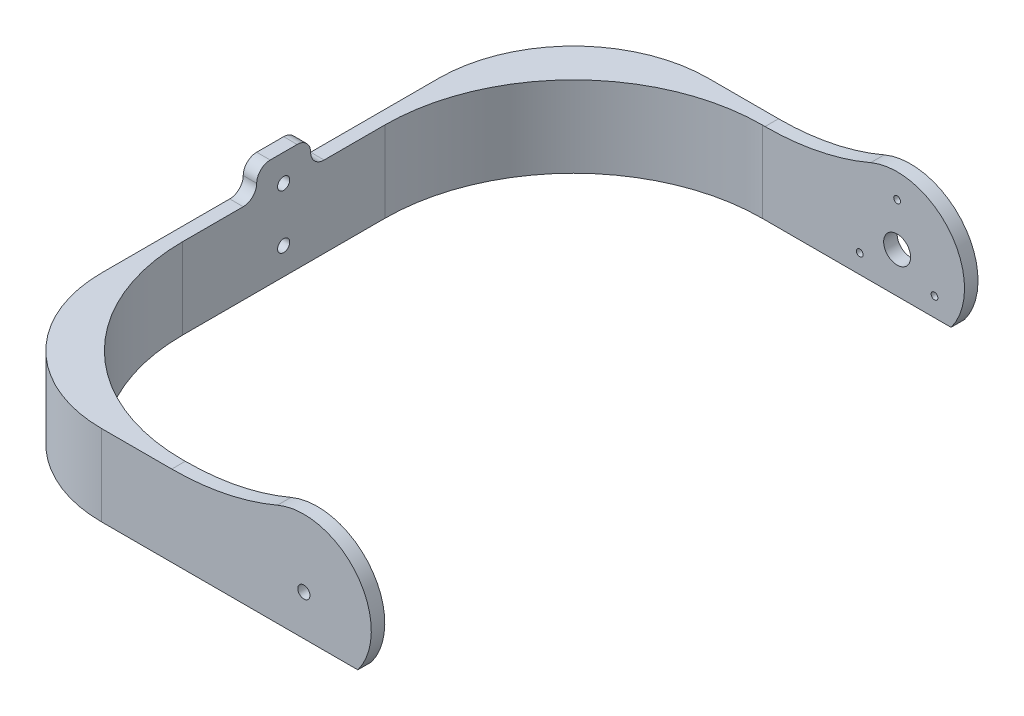
ISO-10303-21;
HEADER;
FILE_DESCRIPTION(('STEP AP214'),'2;1');
FILE_NAME('part.step','',(''),(''),'','','');
FILE_SCHEMA(('AUTOMOTIVE_DESIGN { 1 0 10303 214 1 1 1 1 }'));
ENDSEC;
DATA;
#1=APPLICATION_CONTEXT('core data for automotive mechanical design processes');
#2=APPLICATION_PROTOCOL_DEFINITION('international standard','automotive_design',2000,#1);
#3=PRODUCT_CONTEXT('',#1,'mechanical');
#4=PRODUCT('Part','Part','',(#3));
#5=PRODUCT_RELATED_PRODUCT_CATEGORY('part','',(#4));
#6=PRODUCT_DEFINITION_FORMATION('','',#4);
#7=PRODUCT_DEFINITION_CONTEXT('part definition',#1,'design');
#8=PRODUCT_DEFINITION('design','',#6,#7);
#9=PRODUCT_DEFINITION_SHAPE('','',#8);
#10=(LENGTH_UNIT() NAMED_UNIT(*) SI_UNIT(.MILLI.,.METRE.));
#11=(NAMED_UNIT(*) PLANE_ANGLE_UNIT() SI_UNIT($,.RADIAN.));
#12=(NAMED_UNIT(*) SI_UNIT($,.STERADIAN.) SOLID_ANGLE_UNIT());
#13=UNCERTAINTY_MEASURE_WITH_UNIT(LENGTH_MEASURE(1.E-05),#10,'distance_accuracy_value','');
#14=(GEOMETRIC_REPRESENTATION_CONTEXT(3) GLOBAL_UNCERTAINTY_ASSIGNED_CONTEXT((#13)) GLOBAL_UNIT_ASSIGNED_CONTEXT((#10,
#11,#12)) REPRESENTATION_CONTEXT('',''));
#15=CARTESIAN_POINT('',(0.,0.,0.));
#16=DIRECTION('',(0.,0.,1.));
#17=DIRECTION('',(1.,0.,0.));
#18=AXIS2_PLACEMENT_3D('',#15,#16,#17);
#19=CARTESIAN_POINT('',(0.,30.,112.5));
#20=DIRECTION('',(0.,-1.,0.));
#21=DIRECTION('',(0.,0.,-1.));
#22=AXIS2_PLACEMENT_3D('',#19,#20,#21);
#23=PLANE('',#22);
#24=DIRECTION('',(0.,0.,1.));
#25=VECTOR('',#24,1.);
#26=CARTESIAN_POINT('',(5.,30.,112.5));
#27=LINE('',#26,#25);
#28=CARTESIAN_POINT('',(5.,30.,15.));
#29=VERTEX_POINT('',#28);
#30=CARTESIAN_POINT('',(5.,30.,37.5));
#31=VERTEX_POINT('',#30);
#32=EDGE_CURVE('E356',#29,#31,#27,.T.);
#33=ORIENTED_EDGE('',*,*,#32,.F.);
#34=DIRECTION('',(-1.,0.,0.));
#35=VECTOR('',#34,1.);
#36=CARTESIAN_POINT('',(0.,30.,15.));
#37=LINE('',#36,#35);
#38=CARTESIAN_POINT('',(0.,30.,15.));
#39=VERTEX_POINT('',#38);
#40=EDGE_CURVE('E309',#29,#39,#37,.T.);
#41=ORIENTED_EDGE('',*,*,#40,.T.);
#42=DIRECTION('',(0.,0.,-1.));
#43=VECTOR('',#42,1.);
#44=CARTESIAN_POINT('',(0.,30.,112.5));
#45=LINE('',#44,#43);
#46=CARTESIAN_POINT('',(0.,30.,62.5));
#47=VERTEX_POINT('',#46);
#48=EDGE_CURVE('E215',#47,#39,#45,.T.);
#49=ORIENTED_EDGE('',*,*,#48,.F.);
#50=CARTESIAN_POINT('',(50.,30.,62.5));
#51=DIRECTION('',(0.,-1.,0.));
#52=DIRECTION('',(0.,0.,-1.));
#53=AXIS2_PLACEMENT_3D('',#50,#51,#52);
#54=CIRCLE('',#53,50.);
#55=CARTESIAN_POINT('',(50.,30.,112.5));
#56=VERTEX_POINT('',#55);
#57=EDGE_CURVE('E287',#47,#56,#54,.F.);
#58=ORIENTED_EDGE('',*,*,#57,.T.);
#59=DIRECTION('',(-1.,0.,0.));
#60=VECTOR('',#59,1.);
#61=CARTESIAN_POINT('',(0.,30.,112.5));
#62=LINE('',#61,#60);
#63=CARTESIAN_POINT('',(76.0102051443365,30.,112.5));
#64=VERTEX_POINT('',#63);
#65=EDGE_CURVE('E209',#64,#56,#62,.T.);
#66=ORIENTED_EDGE('',*,*,#65,.F.);
#67=DIRECTION('',(0.,0.,1.));
#68=VECTOR('',#67,1.);
#69=CARTESIAN_POINT('',(76.0102051443365,30.,107.5));
#70=LINE('',#69,#68);
#71=CARTESIAN_POINT('',(76.0102051443365,30.,107.5));
#72=VERTEX_POINT('',#71);
#73=EDGE_CURVE('E245',#64,#72,#70,.F.);
#74=ORIENTED_EDGE('',*,*,#73,.T.);
#75=DIRECTION('',(1.,0.,0.));
#76=VECTOR('',#75,1.);
#77=CARTESIAN_POINT('',(0.,30.,107.5));
#78=LINE('',#77,#76);
#79=CARTESIAN_POINT('',(75.,30.,107.5));
#80=VERTEX_POINT('',#79);
#81=EDGE_CURVE('E191',#80,#72,#78,.T.);
#82=ORIENTED_EDGE('',*,*,#81,.F.);
#83=CARTESIAN_POINT('',(75.,30.,37.5));
#84=DIRECTION('',(0.,-1.,0.));
#85=DIRECTION('',(0.,0.,-1.));
#86=AXIS2_PLACEMENT_3D('',#83,#84,#85);
#87=CIRCLE('',#86,70.);
#88=EDGE_CURVE('E273',#80,#31,#87,.T.);
#89=ORIENTED_EDGE('',*,*,#88,.T.);
#90=EDGE_LOOP('',(#33,#41,#49,#58,#66,#74,#82,#89));
#91=FACE_BOUND('',#90,.T.);
#92=ADVANCED_FACE('F32',(#91),#23,.F.);
#93=CARTESIAN_POINT('',(0.,30.,-15.));
#94=VERTEX_POINT('',#93);
#95=CARTESIAN_POINT('',(0.,30.,-62.5));
#96=VERTEX_POINT('',#95);
#97=EDGE_CURVE('E211',#94,#96,#45,.T.);
#98=ORIENTED_EDGE('',*,*,#97,.F.);
#99=DIRECTION('',(-1.,0.,0.));
#100=VECTOR('',#99,1.);
#101=CARTESIAN_POINT('',(0.,30.,-15.));
#102=LINE('',#101,#100);
#103=CARTESIAN_POINT('',(5.,30.,-15.));
#104=VERTEX_POINT('',#103);
#105=EDGE_CURVE('E307',#94,#104,#102,.F.);
#106=ORIENTED_EDGE('',*,*,#105,.T.);
#107=CARTESIAN_POINT('',(5.,30.,-37.5));
#108=VERTEX_POINT('',#107);
#109=EDGE_CURVE('E357',#108,#104,#27,.T.);
#110=ORIENTED_EDGE('',*,*,#109,.F.);
#111=CARTESIAN_POINT('',(75.,30.,-37.5));
#112=DIRECTION('',(0.,-1.,0.));
#113=DIRECTION('',(0.,0.,-1.));
#114=AXIS2_PLACEMENT_3D('',#111,#112,#113);
#115=CIRCLE('',#114,70.);
#116=CARTESIAN_POINT('',(75.,30.,-107.5));
#117=VERTEX_POINT('',#116);
#118=EDGE_CURVE('E268',#108,#117,#115,.T.);
#119=ORIENTED_EDGE('',*,*,#118,.T.);
#120=DIRECTION('',(-1.,0.,0.));
#121=VECTOR('',#120,1.);
#122=CARTESIAN_POINT('',(0.,30.,-107.5));
#123=LINE('',#122,#121);
#124=CARTESIAN_POINT('',(76.0102051443365,30.,-107.5));
#125=VERTEX_POINT('',#124);
#126=EDGE_CURVE('E192',#125,#117,#123,.T.);
#127=ORIENTED_EDGE('',*,*,#126,.F.);
#128=DIRECTION('',(0.,0.,1.));
#129=VECTOR('',#128,1.);
#130=CARTESIAN_POINT('',(76.0102051443365,30.,-112.5));
#131=LINE('',#130,#129);
#132=CARTESIAN_POINT('',(76.0102051443365,30.,-112.5));
#133=VERTEX_POINT('',#132);
#134=EDGE_CURVE('E243',#125,#133,#131,.F.);
#135=ORIENTED_EDGE('',*,*,#134,.T.);
#136=DIRECTION('',(-1.,0.,0.));
#137=VECTOR('',#136,1.);
#138=CARTESIAN_POINT('',(0.,30.,-112.5));
#139=LINE('',#138,#137);
#140=CARTESIAN_POINT('',(50.,30.,-112.5));
#141=VERTEX_POINT('',#140);
#142=EDGE_CURVE('E200',#133,#141,#139,.T.);
#143=ORIENTED_EDGE('',*,*,#142,.T.);
#144=CARTESIAN_POINT('',(50.,30.,-62.5));
#145=DIRECTION('',(0.,-1.,0.));
#146=DIRECTION('',(0.,0.,-1.));
#147=AXIS2_PLACEMENT_3D('',#144,#145,#146);
#148=CIRCLE('',#147,50.);
#149=EDGE_CURVE('E289',#141,#96,#148,.F.);
#150=ORIENTED_EDGE('',*,*,#149,.T.);
#151=EDGE_LOOP('',(#98,#106,#110,#119,#127,#135,#143,#150));
#152=FACE_BOUND('',#151,.T.);
#153=ADVANCED_FACE('F379',(#152),#23,.F.);
#154=CARTESIAN_POINT('',(0.,0.,112.5));
#155=DIRECTION('',(0.,1.,0.));
#156=DIRECTION('',(0.,0.,1.));
#157=AXIS2_PLACEMENT_3D('',#154,#155,#156);
#158=PLANE('',#157);
#159=DIRECTION('',(0.,0.,-1.));
#160=VECTOR('',#159,1.);
#161=CARTESIAN_POINT('',(0.,0.,112.5));
#162=LINE('',#161,#160);
#163=CARTESIAN_POINT('',(0.,0.,62.5));
#164=VERTEX_POINT('',#163);
#165=CARTESIAN_POINT('',(0.,0.,-62.5));
#166=VERTEX_POINT('',#165);
#167=EDGE_CURVE('E218',#164,#166,#162,.T.);
#168=ORIENTED_EDGE('',*,*,#167,.T.);
#169=CARTESIAN_POINT('',(50.,0.,-62.5));
#170=DIRECTION('',(0.,1.,0.));
#171=DIRECTION('',(0.,0.,1.));
#172=AXIS2_PLACEMENT_3D('',#169,#170,#171);
#173=CIRCLE('',#172,50.);
#174=CARTESIAN_POINT('',(50.,0.,-112.5));
#175=VERTEX_POINT('',#174);
#176=EDGE_CURVE('E283',#166,#175,#173,.F.);
#177=ORIENTED_EDGE('',*,*,#176,.T.);
#178=DIRECTION('',(1.,0.,0.));
#179=VECTOR('',#178,1.);
#180=CARTESIAN_POINT('',(0.,0.,-112.5));
#181=LINE('',#180,#179);
#182=CARTESIAN_POINT('',(145.,0.,-112.5));
#183=VERTEX_POINT('',#182);
#184=EDGE_CURVE('E197',#175,#183,#181,.T.);
#185=ORIENTED_EDGE('',*,*,#184,.T.);
#186=DIRECTION('',(0.,0.,-1.));
#187=VECTOR('',#186,1.);
#188=CARTESIAN_POINT('',(145.,0.,112.5));
#189=LINE('',#188,#187);
#190=CARTESIAN_POINT('',(145.,0.,-107.5));
#191=VERTEX_POINT('',#190);
#192=EDGE_CURVE('E198',#191,#183,#189,.T.);
#193=ORIENTED_EDGE('',*,*,#192,.F.);
#194=DIRECTION('',(1.,0.,0.));
#195=VECTOR('',#194,1.);
#196=CARTESIAN_POINT('',(0.,0.,-107.5));
#197=LINE('',#196,#195);
#198=CARTESIAN_POINT('',(75.,0.,-107.5));
#199=VERTEX_POINT('',#198);
#200=EDGE_CURVE('E228',#199,#191,#197,.T.);
#201=ORIENTED_EDGE('',*,*,#200,.F.);
#202=CARTESIAN_POINT('',(75.,0.,-37.5));
#203=DIRECTION('',(0.,1.,0.));
#204=DIRECTION('',(0.,0.,1.));
#205=AXIS2_PLACEMENT_3D('',#202,#203,#204);
#206=CIRCLE('',#205,70.);
#207=CARTESIAN_POINT('',(5.,0.,-37.5));
#208=VERTEX_POINT('',#207);
#209=EDGE_CURVE('E270',#199,#208,#206,.T.);
#210=ORIENTED_EDGE('',*,*,#209,.T.);
#211=DIRECTION('',(0.,0.,-1.));
#212=VECTOR('',#211,1.);
#213=CARTESIAN_POINT('',(5.,0.,112.5));
#214=LINE('',#213,#212);
#215=CARTESIAN_POINT('',(5.,0.,37.5));
#216=VERTEX_POINT('',#215);
#217=EDGE_CURVE('E179',#216,#208,#214,.T.);
#218=ORIENTED_EDGE('',*,*,#217,.F.);
#219=CARTESIAN_POINT('',(75.,0.,37.5));
#220=DIRECTION('',(0.,1.,0.));
#221=DIRECTION('',(0.,0.,1.));
#222=AXIS2_PLACEMENT_3D('',#219,#220,#221);
#223=CIRCLE('',#222,70.);
#224=CARTESIAN_POINT('',(75.,0.,107.5));
#225=VERTEX_POINT('',#224);
#226=EDGE_CURVE('E190',#216,#225,#223,.T.);
#227=ORIENTED_EDGE('',*,*,#226,.T.);
#228=DIRECTION('',(-1.,0.,0.));
#229=VECTOR('',#228,1.);
#230=CARTESIAN_POINT('',(0.,0.,107.5));
#231=LINE('',#230,#229);
#232=CARTESIAN_POINT('',(145.,0.,107.5));
#233=VERTEX_POINT('',#232);
#234=EDGE_CURVE('E171',#233,#225,#231,.T.);
#235=ORIENTED_EDGE('',*,*,#234,.F.);
#236=CARTESIAN_POINT('',(145.,0.,112.5));
#237=VERTEX_POINT('',#236);
#238=EDGE_CURVE('E187',#237,#233,#189,.T.);
#239=ORIENTED_EDGE('',*,*,#238,.F.);
#240=DIRECTION('',(1.,0.,0.));
#241=VECTOR('',#240,1.);
#242=CARTESIAN_POINT('',(0.,0.,112.5));
#243=LINE('',#242,#241);
#244=CARTESIAN_POINT('',(50.,0.,112.5));
#245=VERTEX_POINT('',#244);
#246=EDGE_CURVE('E207',#245,#237,#243,.T.);
#247=ORIENTED_EDGE('',*,*,#246,.F.);
#248=CARTESIAN_POINT('',(50.,0.,62.5));
#249=DIRECTION('',(0.,1.,0.));
#250=DIRECTION('',(0.,0.,1.));
#251=AXIS2_PLACEMENT_3D('',#248,#249,#250);
#252=CIRCLE('',#251,50.);
#253=EDGE_CURVE('E281',#245,#164,#252,.F.);
#254=ORIENTED_EDGE('',*,*,#253,.T.);
#255=EDGE_LOOP('',(#168,#177,#185,#193,#201,#210,#218,#227,#235,#239,#247,#254));
#256=FACE_BOUND('',#255,.T.);
#257=ADVANCED_FACE('F185',(#256),#158,.F.);
#258=CARTESIAN_POINT('',(125.,15.,112.5));
#259=DIRECTION('',(0.,0.,-1.));
#260=DIRECTION('',(-1.,0.,0.));
#261=AXIS2_PLACEMENT_3D('',#258,#259,#260);
#262=CYLINDRICAL_SURFACE('',#261,25.);
#263=CARTESIAN_POINT('',(125.,15.,107.5));
#264=DIRECTION('',(0.,0.,-1.));
#265=DIRECTION('',(0.,1.,0.));
#266=AXIS2_PLACEMENT_3D('',#263,#264,#265);
#267=CIRCLE('',#266,25.);
#268=CARTESIAN_POINT('',(115.202041028867,38.,107.5));
#269=VERTEX_POINT('',#268);
#270=EDGE_CURVE('E168',#269,#233,#267,.T.);
#271=ORIENTED_EDGE('',*,*,#270,.F.);
#272=DIRECTION('',(0.,0.,-1.));
#273=VECTOR('',#272,1.);
#274=CARTESIAN_POINT('',(115.202041028867,38.,112.5));
#275=LINE('',#274,#273);
#276=CARTESIAN_POINT('',(115.202041028867,38.,112.5));
#277=VERTEX_POINT('',#276);
#278=EDGE_CURVE('E224',#269,#277,#275,.F.);
#279=ORIENTED_EDGE('',*,*,#278,.T.);
#280=CARTESIAN_POINT('',(125.,15.,112.5));
#281=DIRECTION('',(0.,0.,1.));
#282=DIRECTION('',(1.,0.,0.));
#283=AXIS2_PLACEMENT_3D('',#280,#281,#282);
#284=CIRCLE('',#283,25.);
#285=EDGE_CURVE('E196',#237,#277,#284,.T.);
#286=ORIENTED_EDGE('',*,*,#285,.F.);
#287=ORIENTED_EDGE('',*,*,#238,.T.);
#288=EDGE_LOOP('',(#271,#279,#286,#287));
#289=FACE_BOUND('',#288,.T.);
#290=ADVANCED_FACE('F194',(#289),#262,.T.);
#291=CARTESIAN_POINT('',(125.,15.,-112.5));
#292=DIRECTION('',(0.,0.,1.));
#293=DIRECTION('',(1.,0.,0.));
#294=AXIS2_PLACEMENT_3D('',#291,#292,#293);
#295=CIRCLE('',#294,25.);
#296=CARTESIAN_POINT('',(115.202041028867,38.,-112.5));
#297=VERTEX_POINT('',#296);
#298=EDGE_CURVE('E205',#183,#297,#295,.T.);
#299=ORIENTED_EDGE('',*,*,#298,.T.);
#300=DIRECTION('',(0.,0.,-1.));
#301=VECTOR('',#300,1.);
#302=CARTESIAN_POINT('',(115.202041028867,38.,112.5));
#303=LINE('',#302,#301);
#304=CARTESIAN_POINT('',(115.202041028867,38.,-107.5));
#305=VERTEX_POINT('',#304);
#306=EDGE_CURVE('E248',#297,#305,#303,.F.);
#307=ORIENTED_EDGE('',*,*,#306,.T.);
#308=CARTESIAN_POINT('',(125.,15.,-107.5));
#309=DIRECTION('',(0.,0.,1.));
#310=DIRECTION('',(0.,-1.,0.));
#311=AXIS2_PLACEMENT_3D('',#308,#309,#310);
#312=CIRCLE('',#311,25.);
#313=EDGE_CURVE('E180',#191,#305,#312,.T.);
#314=ORIENTED_EDGE('',*,*,#313,.F.);
#315=ORIENTED_EDGE('',*,*,#192,.T.);
#316=EDGE_LOOP('',(#299,#307,#314,#315));
#317=FACE_BOUND('',#316,.T.);
#318=ADVANCED_FACE('F364',(#317),#262,.T.);
#319=CARTESIAN_POINT('',(0.,0.,112.5));
#320=DIRECTION('',(1.,0.,0.));
#321=DIRECTION('',(0.,0.,-1.));
#322=AXIS2_PLACEMENT_3D('',#319,#320,#321);
#323=PLANE('',#322);
#324=CARTESIAN_POINT('',(0.,30.,0.));
#325=DIRECTION('',(-1.,0.,0.));
#326=DIRECTION('',(0.,0.,1.));
#327=AXIS2_PLACEMENT_3D('',#324,#325,#326);
#328=CIRCLE('',#327,2.25);
#329=CARTESIAN_POINT('',(0.,30.,2.25));
#330=VERTEX_POINT('',#329);
#331=EDGE_CURVE('E304',#330,#330,#328,.T.);
#332=ORIENTED_EDGE('',*,*,#331,.F.);
#333=EDGE_LOOP('',(#332));
#334=FACE_BOUND('',#333,.T.);
#335=CARTESIAN_POINT('',(0.,10.,0.));
#336=DIRECTION('',(-1.,0.,0.));
#337=DIRECTION('',(0.,0.,1.));
#338=AXIS2_PLACEMENT_3D('',#335,#336,#337);
#339=CIRCLE('',#338,2.25);
#340=CARTESIAN_POINT('',(0.,10.,2.25));
#341=VERTEX_POINT('',#340);
#342=EDGE_CURVE('E300',#341,#341,#339,.T.);
#343=ORIENTED_EDGE('',*,*,#342,.F.);
#344=EDGE_LOOP('',(#343));
#345=FACE_BOUND('',#344,.T.);
#346=CARTESIAN_POINT('',(0.,35.,15.));
#347=DIRECTION('',(1.,0.,0.));
#348=DIRECTION('',(0.,0.,-1.));
#349=AXIS2_PLACEMENT_3D('',#346,#347,#348);
#350=CIRCLE('',#349,5.);
#351=CARTESIAN_POINT('',(0.,35.,10.));
#352=VERTEX_POINT('',#351);
#353=EDGE_CURVE('E319',#39,#352,#350,.T.);
#354=ORIENTED_EDGE('',*,*,#353,.T.);
#355=CARTESIAN_POINT('',(0.,35.,5.00000000000001));
#356=DIRECTION('',(1.,0.,0.));
#357=DIRECTION('',(0.,0.,-1.));
#358=AXIS2_PLACEMENT_3D('',#355,#356,#357);
#359=CIRCLE('',#358,5.);
#360=CARTESIAN_POINT('',(0.,40.,5.00000000000001));
#361=VERTEX_POINT('',#360);
#362=EDGE_CURVE('E326',#352,#361,#359,.F.);
#363=ORIENTED_EDGE('',*,*,#362,.T.);
#364=DIRECTION('',(0.,0.,-1.));
#365=VECTOR('',#364,1.);
#366=CARTESIAN_POINT('',(0.,40.,-9.99999999999998));
#367=LINE('',#366,#365);
#368=CARTESIAN_POINT('',(0.,40.,-4.99999999999998));
#369=VERTEX_POINT('',#368);
#370=EDGE_CURVE('E299',#361,#369,#367,.T.);
#371=ORIENTED_EDGE('',*,*,#370,.T.);
#372=CARTESIAN_POINT('',(0.,35.,-4.99999999999998));
#373=DIRECTION('',(1.,0.,0.));
#374=DIRECTION('',(0.,0.,-1.));
#375=AXIS2_PLACEMENT_3D('',#372,#373,#374);
#376=CIRCLE('',#375,5.);
#377=CARTESIAN_POINT('',(0.,35.,-9.99999999999998));
#378=VERTEX_POINT('',#377);
#379=EDGE_CURVE('E324',#369,#378,#376,.F.);
#380=ORIENTED_EDGE('',*,*,#379,.T.);
#381=CARTESIAN_POINT('',(0.,35.,-15.));
#382=DIRECTION('',(1.,0.,0.));
#383=DIRECTION('',(0.,0.,-1.));
#384=AXIS2_PLACEMENT_3D('',#381,#382,#383);
#385=CIRCLE('',#384,5.);
#386=EDGE_CURVE('E315',#378,#94,#385,.T.);
#387=ORIENTED_EDGE('',*,*,#386,.T.);
#388=ORIENTED_EDGE('',*,*,#97,.T.);
#389=DIRECTION('',(0.,-1.,0.));
#390=VECTOR('',#389,1.);
#391=CARTESIAN_POINT('',(0.,0.,-62.5));
#392=LINE('',#391,#390);
#393=EDGE_CURVE('E278',#96,#166,#392,.T.);
#394=ORIENTED_EDGE('',*,*,#393,.T.);
#395=ORIENTED_EDGE('',*,*,#167,.F.);
#396=DIRECTION('',(0.,-1.,0.));
#397=VECTOR('',#396,1.);
#398=CARTESIAN_POINT('',(0.,0.,62.5));
#399=LINE('',#398,#397);
#400=EDGE_CURVE('E276',#164,#47,#399,.F.);
#401=ORIENTED_EDGE('',*,*,#400,.T.);
#402=ORIENTED_EDGE('',*,*,#48,.T.);
#403=EDGE_LOOP('',(#354,#363,#371,#380,#387,#388,#394,#395,#401,#402));
#404=FACE_BOUND('',#403,.T.);
#405=ADVANCED_FACE('F337',(#334,#345,#404),#323,.F.);
#406=CARTESIAN_POINT('',(0.,0.,112.5));
#407=DIRECTION('',(0.,0.,-1.));
#408=DIRECTION('',(-1.,0.,0.));
#409=AXIS2_PLACEMENT_3D('',#406,#407,#408);
#410=PLANE('',#409);
#411=CARTESIAN_POINT('',(125.,14.9999999999999,112.5));
#412=DIRECTION('',(0.,0.,-1.));
#413=DIRECTION('',(-1.,0.,0.));
#414=AXIS2_PLACEMENT_3D('',#411,#412,#413);
#415=CIRCLE('',#414,2.25);
#416=CARTESIAN_POINT('',(125.,17.2499999999999,112.5));
#417=VERTEX_POINT('',#416);
#418=EDGE_CURVE('E514',#417,#417,#415,.F.);
#419=ORIENTED_EDGE('',*,*,#418,.F.);
#420=EDGE_LOOP('',(#419));
#421=FACE_BOUND('',#420,.T.);
#422=ORIENTED_EDGE('',*,*,#65,.T.);
#423=DIRECTION('',(0.,-1.,0.));
#424=VECTOR('',#423,1.);
#425=CARTESIAN_POINT('',(50.,0.,112.5));
#426=LINE('',#425,#424);
#427=EDGE_CURVE('E292',#56,#245,#426,.T.);
#428=ORIENTED_EDGE('',*,*,#427,.T.);
#429=ORIENTED_EDGE('',*,*,#246,.T.);
#430=ORIENTED_EDGE('',*,*,#285,.T.);
#431=CARTESIAN_POINT('',(76.0102051443365,130.,112.5));
#432=DIRECTION('',(0.,0.,-1.));
#433=DIRECTION('',(-1.,0.,0.));
#434=AXIS2_PLACEMENT_3D('',#431,#432,#433);
#435=CIRCLE('',#434,100.);
#436=EDGE_CURVE('E251',#277,#64,#435,.T.);
#437=ORIENTED_EDGE('',*,*,#436,.T.);
#438=EDGE_LOOP('',(#422,#428,#429,#430,#437));
#439=FACE_BOUND('',#438,.T.);
#440=ADVANCED_FACE('F425',(#421,#439),#410,.F.);
#441=CARTESIAN_POINT('',(0.,0.,-112.5));
#442=DIRECTION('',(0.,0.,-1.));
#443=DIRECTION('',(-1.,0.,0.));
#444=AXIS2_PLACEMENT_3D('',#441,#442,#443);
#445=PLANE('',#444);
#446=CARTESIAN_POINT('',(111.143593539449,6.99999999999984,-112.5));
#447=DIRECTION('',(0.,0.,-1.));
#448=DIRECTION('',(-1.,0.,0.));
#449=AXIS2_PLACEMENT_3D('',#446,#447,#448);
#450=CIRCLE('',#449,1.25000000000001);
#451=CARTESIAN_POINT('',(109.893593539449,6.99999999999984,-112.5));
#452=VERTEX_POINT('',#451);
#453=EDGE_CURVE('E241',#452,#452,#450,.T.);
#454=ORIENTED_EDGE('',*,*,#453,.F.);
#455=EDGE_LOOP('',(#454));
#456=FACE_BOUND('',#455,.T.);
#457=CARTESIAN_POINT('',(125.,31.,-112.5));
#458=DIRECTION('',(0.,0.,-1.));
#459=DIRECTION('',(-1.,0.,0.));
#460=AXIS2_PLACEMENT_3D('',#457,#458,#459);
#461=CIRCLE('',#460,1.24999999999996);
#462=CARTESIAN_POINT('',(123.75,31.,-112.5));
#463=VERTEX_POINT('',#462);
#464=EDGE_CURVE('E237',#463,#463,#461,.T.);
#465=ORIENTED_EDGE('',*,*,#464,.F.);
#466=EDGE_LOOP('',(#465));
#467=FACE_BOUND('',#466,.T.);
#468=CARTESIAN_POINT('',(138.856406460551,7.,-112.5));
#469=DIRECTION('',(0.,0.,-1.));
#470=DIRECTION('',(-1.,0.,0.));
#471=AXIS2_PLACEMENT_3D('',#468,#469,#470);
#472=CIRCLE('',#471,1.25000000000001);
#473=CARTESIAN_POINT('',(137.606406460551,7.,-112.5));
#474=VERTEX_POINT('',#473);
#475=EDGE_CURVE('E233',#474,#474,#472,.T.);
#476=ORIENTED_EDGE('',*,*,#475,.F.);
#477=EDGE_LOOP('',(#476));
#478=FACE_BOUND('',#477,.T.);
#479=CARTESIAN_POINT('',(125.004149617309,15.,-112.5));
#480=DIRECTION('',(0.,0.,-1.));
#481=DIRECTION('',(-1.,0.,0.));
#482=AXIS2_PLACEMENT_3D('',#479,#480,#481);
#483=CIRCLE('',#482,5.);
#484=CARTESIAN_POINT('',(120.004149617309,15.,-112.5));
#485=VERTEX_POINT('',#484);
#486=EDGE_CURVE('E229',#485,#485,#483,.T.);
#487=ORIENTED_EDGE('',*,*,#486,.F.);
#488=EDGE_LOOP('',(#487));
#489=FACE_BOUND('',#488,.T.);
#490=ORIENTED_EDGE('',*,*,#184,.F.);
#491=DIRECTION('',(0.,-1.,0.));
#492=VECTOR('',#491,1.);
#493=CARTESIAN_POINT('',(50.,30.,-112.5));
#494=LINE('',#493,#492);
#495=EDGE_CURVE('E285',#175,#141,#494,.F.);
#496=ORIENTED_EDGE('',*,*,#495,.T.);
#497=ORIENTED_EDGE('',*,*,#142,.F.);
#498=CARTESIAN_POINT('',(76.0102051443365,130.,-112.5));
#499=DIRECTION('',(0.,0.,-1.));
#500=DIRECTION('',(-1.,0.,0.));
#501=AXIS2_PLACEMENT_3D('',#498,#499,#500);
#502=CIRCLE('',#501,100.);
#503=EDGE_CURVE('E256',#133,#297,#502,.F.);
#504=ORIENTED_EDGE('',*,*,#503,.T.);
#505=ORIENTED_EDGE('',*,*,#298,.F.);
#506=EDGE_LOOP('',(#490,#496,#497,#504,#505));
#507=FACE_BOUND('',#506,.T.);
#508=ADVANCED_FACE('F391',(#456,#467,#478,#489,#507),#445,.T.);
#509=CARTESIAN_POINT('',(5.,0.,0.));
#510=DIRECTION('',(1.,0.,0.));
#511=DIRECTION('',(0.,0.,-1.));
#512=AXIS2_PLACEMENT_3D('',#509,#510,#511);
#513=PLANE('',#512);
#514=CARTESIAN_POINT('',(5.,30.,0.));
#515=DIRECTION('',(1.,0.,0.));
#516=DIRECTION('',(0.,0.,-1.));
#517=AXIS2_PLACEMENT_3D('',#514,#515,#516);
#518=CIRCLE('',#517,2.25);
#519=CARTESIAN_POINT('',(5.,30.,-2.25));
#520=VERTEX_POINT('',#519);
#521=EDGE_CURVE('E301',#520,#520,#518,.T.);
#522=ORIENTED_EDGE('',*,*,#521,.F.);
#523=EDGE_LOOP('',(#522));
#524=FACE_BOUND('',#523,.T.);
#525=CARTESIAN_POINT('',(5.,10.,0.));
#526=DIRECTION('',(1.,0.,0.));
#527=DIRECTION('',(0.,0.,-1.));
#528=AXIS2_PLACEMENT_3D('',#525,#526,#527);
#529=CIRCLE('',#528,2.25);
#530=CARTESIAN_POINT('',(5.,10.,-2.25));
#531=VERTEX_POINT('',#530);
#532=EDGE_CURVE('E296',#531,#531,#529,.T.);
#533=ORIENTED_EDGE('',*,*,#532,.F.);
#534=EDGE_LOOP('',(#533));
#535=FACE_BOUND('',#534,.T.);
#536=DIRECTION('',(0.,0.,-1.));
#537=VECTOR('',#536,1.);
#538=CARTESIAN_POINT('',(5.,40.,-9.99999999999998));
#539=LINE('',#538,#537);
#540=CARTESIAN_POINT('',(5.,40.,5.00000000000001));
#541=VERTEX_POINT('',#540);
#542=CARTESIAN_POINT('',(5.,40.,-4.99999999999998));
#543=VERTEX_POINT('',#542);
#544=EDGE_CURVE('E334',#541,#543,#539,.T.);
#545=ORIENTED_EDGE('',*,*,#544,.F.);
#546=CARTESIAN_POINT('',(5.,35.,5.00000000000001));
#547=DIRECTION('',(1.,0.,0.));
#548=DIRECTION('',(0.,0.,-1.));
#549=AXIS2_PLACEMENT_3D('',#546,#547,#548);
#550=CIRCLE('',#549,5.);
#551=CARTESIAN_POINT('',(5.,35.,10.));
#552=VERTEX_POINT('',#551);
#553=EDGE_CURVE('E11',#541,#552,#550,.T.);
#554=ORIENTED_EDGE('',*,*,#553,.T.);
#555=CARTESIAN_POINT('',(5.,35.,15.));
#556=DIRECTION('',(1.,0.,0.));
#557=DIRECTION('',(0.,0.,-1.));
#558=AXIS2_PLACEMENT_3D('',#555,#556,#557);
#559=CIRCLE('',#558,5.);
#560=EDGE_CURVE('E322',#552,#29,#559,.F.);
#561=ORIENTED_EDGE('',*,*,#560,.T.);
#562=ORIENTED_EDGE('',*,*,#32,.T.);
#563=DIRECTION('',(0.,-1.,0.));
#564=VECTOR('',#563,1.);
#565=CARTESIAN_POINT('',(5.,0.,37.5));
#566=LINE('',#565,#564);
#567=EDGE_CURVE('E258',#31,#216,#566,.T.);
#568=ORIENTED_EDGE('',*,*,#567,.T.);
#569=ORIENTED_EDGE('',*,*,#217,.T.);
#570=DIRECTION('',(0.,1.,0.));
#571=VECTOR('',#570,1.);
#572=CARTESIAN_POINT('',(5.,30.,-37.5));
#573=LINE('',#572,#571);
#574=EDGE_CURVE('E261',#208,#108,#573,.T.);
#575=ORIENTED_EDGE('',*,*,#574,.T.);
#576=ORIENTED_EDGE('',*,*,#109,.T.);
#577=CARTESIAN_POINT('',(5.,35.,-15.));
#578=DIRECTION('',(1.,0.,0.));
#579=DIRECTION('',(0.,0.,-1.));
#580=AXIS2_PLACEMENT_3D('',#577,#578,#579);
#581=CIRCLE('',#580,5.);
#582=CARTESIAN_POINT('',(5.,35.,-9.99999999999998));
#583=VERTEX_POINT('',#582);
#584=EDGE_CURVE('E317',#104,#583,#581,.F.);
#585=ORIENTED_EDGE('',*,*,#584,.T.);
#586=CARTESIAN_POINT('',(5.,35.,-4.99999999999998));
#587=DIRECTION('',(1.,0.,0.));
#588=DIRECTION('',(0.,0.,-1.));
#589=AXIS2_PLACEMENT_3D('',#586,#587,#588);
#590=CIRCLE('',#589,5.);
#591=EDGE_CURVE('E40',#583,#543,#590,.T.);
#592=ORIENTED_EDGE('',*,*,#591,.T.);
#593=EDGE_LOOP('',(#545,#554,#561,#562,#568,#569,#575,#576,#585,#592));
#594=FACE_BOUND('',#593,.T.);
#595=ADVANCED_FACE('F386',(#524,#535,#594),#513,.T.);
#596=CARTESIAN_POINT('',(165.,55.7623622305591,107.5));
#597=DIRECTION('',(0.,0.,-1.));
#598=DIRECTION('',(0.,1.,0.));
#599=AXIS2_PLACEMENT_3D('',#596,#597,#598);
#600=PLANE('',#599);
#601=CARTESIAN_POINT('',(125.,15.,107.5));
#602=DIRECTION('',(0.,0.,-1.));
#603=DIRECTION('',(0.,1.,0.));
#604=AXIS2_PLACEMENT_3D('',#601,#602,#603);
#605=CIRCLE('',#604,2.25);
#606=CARTESIAN_POINT('',(125.,17.2499999999999,107.5));
#607=VERTEX_POINT('',#606);
#608=EDGE_CURVE('E516',#607,#607,#605,.T.);
#609=ORIENTED_EDGE('',*,*,#608,.F.);
#610=EDGE_LOOP('',(#609));
#611=FACE_BOUND('',#610,.T.);
#612=ORIENTED_EDGE('',*,*,#234,.T.);
#613=DIRECTION('',(0.,-1.,0.));
#614=VECTOR('',#613,1.);
#615=CARTESIAN_POINT('',(75.,30.,107.5));
#616=LINE('',#615,#614);
#617=EDGE_CURVE('E266',#225,#80,#616,.F.);
#618=ORIENTED_EDGE('',*,*,#617,.T.);
#619=ORIENTED_EDGE('',*,*,#81,.T.);
#620=CARTESIAN_POINT('',(76.0102051443365,130.,107.5));
#621=DIRECTION('',(0.,0.,-1.));
#622=DIRECTION('',(0.,1.,0.));
#623=AXIS2_PLACEMENT_3D('',#620,#621,#622);
#624=CIRCLE('',#623,100.);
#625=EDGE_CURVE('E174',#72,#269,#624,.F.);
#626=ORIENTED_EDGE('',*,*,#625,.T.);
#627=ORIENTED_EDGE('',*,*,#270,.T.);
#628=EDGE_LOOP('',(#612,#618,#619,#626,#627));
#629=FACE_BOUND('',#628,.T.);
#630=ADVANCED_FACE('F170',(#611,#629),#600,.T.);
#631=CARTESIAN_POINT('',(165.,55.7623622305591,-107.5));
#632=DIRECTION('',(0.,0.,1.));
#633=DIRECTION('',(0.,-1.,0.));
#634=AXIS2_PLACEMENT_3D('',#631,#632,#633);
#635=PLANE('',#634);
#636=CARTESIAN_POINT('',(111.143593539449,6.99999999999984,-107.5));
#637=DIRECTION('',(0.,0.,1.));
#638=DIRECTION('',(0.,-1.,0.));
#639=AXIS2_PLACEMENT_3D('',#636,#637,#638);
#640=CIRCLE('',#639,1.25000000000001);
#641=CARTESIAN_POINT('',(111.143593539449,5.74999999999983,-107.5));
#642=VERTEX_POINT('',#641);
#643=EDGE_CURVE('E238',#642,#642,#640,.T.);
#644=ORIENTED_EDGE('',*,*,#643,.F.);
#645=EDGE_LOOP('',(#644));
#646=FACE_BOUND('',#645,.T.);
#647=CARTESIAN_POINT('',(125.,31.,-107.5));
#648=DIRECTION('',(0.,0.,1.));
#649=DIRECTION('',(0.,-1.,0.));
#650=AXIS2_PLACEMENT_3D('',#647,#648,#649);
#651=CIRCLE('',#650,1.24999999999996);
#652=CARTESIAN_POINT('',(125.,29.75,-107.5));
#653=VERTEX_POINT('',#652);
#654=EDGE_CURVE('E234',#653,#653,#651,.T.);
#655=ORIENTED_EDGE('',*,*,#654,.F.);
#656=EDGE_LOOP('',(#655));
#657=FACE_BOUND('',#656,.T.);
#658=CARTESIAN_POINT('',(138.856406460551,7.,-107.5));
#659=DIRECTION('',(0.,0.,1.));
#660=DIRECTION('',(0.,-1.,0.));
#661=AXIS2_PLACEMENT_3D('',#658,#659,#660);
#662=CIRCLE('',#661,1.25000000000001);
#663=CARTESIAN_POINT('',(138.856406460551,5.74999999999999,-107.5));
#664=VERTEX_POINT('',#663);
#665=EDGE_CURVE('E230',#664,#664,#662,.T.);
#666=ORIENTED_EDGE('',*,*,#665,.F.);
#667=EDGE_LOOP('',(#666));
#668=FACE_BOUND('',#667,.T.);
#669=CARTESIAN_POINT('',(125.004149617309,15.,-107.5));
#670=DIRECTION('',(0.,0.,1.));
#671=DIRECTION('',(0.,-1.,0.));
#672=AXIS2_PLACEMENT_3D('',#669,#670,#671);
#673=CIRCLE('',#672,5.);
#674=CARTESIAN_POINT('',(125.004149617309,9.99999999999999,-107.5));
#675=VERTEX_POINT('',#674);
#676=EDGE_CURVE('E225',#675,#675,#673,.T.);
#677=ORIENTED_EDGE('',*,*,#676,.F.);
#678=EDGE_LOOP('',(#677));
#679=FACE_BOUND('',#678,.T.);
#680=ORIENTED_EDGE('',*,*,#126,.T.);
#681=DIRECTION('',(0.,1.,0.));
#682=VECTOR('',#681,1.);
#683=CARTESIAN_POINT('',(75.,0.,-107.5));
#684=LINE('',#683,#682);
#685=EDGE_CURVE('E264',#117,#199,#684,.F.);
#686=ORIENTED_EDGE('',*,*,#685,.T.);
#687=ORIENTED_EDGE('',*,*,#200,.T.);
#688=ORIENTED_EDGE('',*,*,#313,.T.);
#689=CARTESIAN_POINT('',(76.0102051443365,130.,-107.5));
#690=DIRECTION('',(0.,0.,1.));
#691=DIRECTION('',(0.,-1.,0.));
#692=AXIS2_PLACEMENT_3D('',#689,#690,#691);
#693=CIRCLE('',#692,100.);
#694=EDGE_CURVE('E254',#305,#125,#693,.F.);
#695=ORIENTED_EDGE('',*,*,#694,.T.);
#696=EDGE_LOOP('',(#680,#686,#687,#688,#695));
#697=FACE_BOUND('',#696,.T.);
#698=ADVANCED_FACE('F375',(#646,#657,#668,#679,#697),#635,.T.);
#699=CARTESIAN_POINT('',(125.004149617309,15.,-102.5));
#700=DIRECTION('',(0.,0.,-1.));
#701=DIRECTION('',(-1.,0.,0.));
#702=AXIS2_PLACEMENT_3D('',#699,#700,#701);
#703=CYLINDRICAL_SURFACE('',#702,5.);
#704=ORIENTED_EDGE('',*,*,#676,.T.);
#705=EDGE_LOOP('',(#704));
#706=FACE_BOUND('',#705,.T.);
#707=ORIENTED_EDGE('',*,*,#486,.T.);
#708=EDGE_LOOP('',(#707));
#709=FACE_BOUND('',#708,.T.);
#710=ADVANCED_FACE('F481',(#706,#709),#703,.F.);
#711=CARTESIAN_POINT('',(138.856406460551,7.,-102.5));
#712=DIRECTION('',(0.,0.,-1.));
#713=DIRECTION('',(-1.,0.,0.));
#714=AXIS2_PLACEMENT_3D('',#711,#712,#713);
#715=CYLINDRICAL_SURFACE('',#714,1.25000000000001);
#716=ORIENTED_EDGE('',*,*,#665,.T.);
#717=EDGE_LOOP('',(#716));
#718=FACE_BOUND('',#717,.T.);
#719=ORIENTED_EDGE('',*,*,#475,.T.);
#720=EDGE_LOOP('',(#719));
#721=FACE_BOUND('',#720,.T.);
#722=ADVANCED_FACE('F488',(#718,#721),#715,.F.);
#723=CARTESIAN_POINT('',(125.,31.,-102.5));
#724=DIRECTION('',(0.,0.,-1.));
#725=DIRECTION('',(-1.,0.,0.));
#726=AXIS2_PLACEMENT_3D('',#723,#724,#725);
#727=CYLINDRICAL_SURFACE('',#726,1.24999999999996);
#728=ORIENTED_EDGE('',*,*,#654,.T.);
#729=EDGE_LOOP('',(#728));
#730=FACE_BOUND('',#729,.T.);
#731=ORIENTED_EDGE('',*,*,#464,.T.);
#732=EDGE_LOOP('',(#731));
#733=FACE_BOUND('',#732,.T.);
#734=ADVANCED_FACE('F492',(#730,#733),#727,.F.);
#735=CARTESIAN_POINT('',(111.143593539449,6.99999999999984,-102.5));
#736=DIRECTION('',(0.,0.,-1.));
#737=DIRECTION('',(-1.,0.,0.));
#738=AXIS2_PLACEMENT_3D('',#735,#736,#737);
#739=CYLINDRICAL_SURFACE('',#738,1.25000000000001);
#740=ORIENTED_EDGE('',*,*,#643,.T.);
#741=EDGE_LOOP('',(#740));
#742=FACE_BOUND('',#741,.T.);
#743=ORIENTED_EDGE('',*,*,#453,.T.);
#744=EDGE_LOOP('',(#743));
#745=FACE_BOUND('',#744,.T.);
#746=ADVANCED_FACE('F430',(#742,#745),#739,.F.);
#747=CARTESIAN_POINT('',(76.0102051443365,130.,112.5));
#748=DIRECTION('',(0.,0.,-1.));
#749=DIRECTION('',(-1.,0.,0.));
#750=AXIS2_PLACEMENT_3D('',#747,#748,#749);
#751=CYLINDRICAL_SURFACE('',#750,100.);
#752=ORIENTED_EDGE('',*,*,#625,.F.);
#753=ORIENTED_EDGE('',*,*,#73,.F.);
#754=ORIENTED_EDGE('',*,*,#436,.F.);
#755=ORIENTED_EDGE('',*,*,#278,.F.);
#756=EDGE_LOOP('',(#752,#753,#754,#755));
#757=FACE_BOUND('',#756,.T.);
#758=ADVANCED_FACE('F427',(#757),#751,.F.);
#759=CARTESIAN_POINT('',(76.0102051443365,130.,112.5));
#760=DIRECTION('',(0.,0.,-1.));
#761=DIRECTION('',(-1.,0.,0.));
#762=AXIS2_PLACEMENT_3D('',#759,#760,#761);
#763=CYLINDRICAL_SURFACE('',#762,100.);
#764=ORIENTED_EDGE('',*,*,#503,.F.);
#765=ORIENTED_EDGE('',*,*,#134,.F.);
#766=ORIENTED_EDGE('',*,*,#694,.F.);
#767=ORIENTED_EDGE('',*,*,#306,.F.);
#768=EDGE_LOOP('',(#764,#765,#766,#767));
#769=FACE_BOUND('',#768,.T.);
#770=ADVANCED_FACE('F371',(#769),#763,.F.);
#771=CARTESIAN_POINT('',(75.,0.,-37.5));
#772=DIRECTION('',(0.,-1.,0.));
#773=DIRECTION('',(0.,0.,-1.));
#774=AXIS2_PLACEMENT_3D('',#771,#772,#773);
#775=CYLINDRICAL_SURFACE('',#774,70.);
#776=ORIENTED_EDGE('',*,*,#209,.F.);
#777=ORIENTED_EDGE('',*,*,#685,.F.);
#778=ORIENTED_EDGE('',*,*,#118,.F.);
#779=ORIENTED_EDGE('',*,*,#574,.F.);
#780=EDGE_LOOP('',(#776,#777,#778,#779));
#781=FACE_BOUND('',#780,.T.);
#782=ADVANCED_FACE('F385',(#781),#775,.F.);
#783=CARTESIAN_POINT('',(75.,0.,37.5));
#784=DIRECTION('',(0.,1.,0.));
#785=DIRECTION('',(0.,0.,1.));
#786=AXIS2_PLACEMENT_3D('',#783,#784,#785);
#787=CYLINDRICAL_SURFACE('',#786,70.);
#788=ORIENTED_EDGE('',*,*,#88,.F.);
#789=ORIENTED_EDGE('',*,*,#617,.F.);
#790=ORIENTED_EDGE('',*,*,#226,.F.);
#791=ORIENTED_EDGE('',*,*,#567,.F.);
#792=EDGE_LOOP('',(#788,#789,#790,#791));
#793=FACE_BOUND('',#792,.T.);
#794=ADVANCED_FACE('F436',(#793),#787,.F.);
#795=CARTESIAN_POINT('',(50.,0.,-62.5));
#796=DIRECTION('',(0.,1.,0.));
#797=DIRECTION('',(0.,0.,1.));
#798=AXIS2_PLACEMENT_3D('',#795,#796,#797);
#799=CYLINDRICAL_SURFACE('',#798,50.);
#800=ORIENTED_EDGE('',*,*,#149,.F.);
#801=ORIENTED_EDGE('',*,*,#495,.F.);
#802=ORIENTED_EDGE('',*,*,#176,.F.);
#803=ORIENTED_EDGE('',*,*,#393,.F.);
#804=EDGE_LOOP('',(#800,#801,#802,#803));
#805=FACE_BOUND('',#804,.T.);
#806=ADVANCED_FACE('F394',(#805),#799,.T.);
#807=CARTESIAN_POINT('',(50.,0.,62.5));
#808=DIRECTION('',(0.,-1.,0.));
#809=DIRECTION('',(0.,0.,-1.));
#810=AXIS2_PLACEMENT_3D('',#807,#808,#809);
#811=CYLINDRICAL_SURFACE('',#810,50.);
#812=ORIENTED_EDGE('',*,*,#57,.F.);
#813=ORIENTED_EDGE('',*,*,#400,.F.);
#814=ORIENTED_EDGE('',*,*,#253,.F.);
#815=ORIENTED_EDGE('',*,*,#427,.F.);
#816=EDGE_LOOP('',(#812,#813,#814,#815));
#817=FACE_BOUND('',#816,.T.);
#818=ADVANCED_FACE('F442',(#817),#811,.T.);
#819=CARTESIAN_POINT('',(27.3606797749979,40.,-9.99999999999998));
#820=DIRECTION('',(0.,1.,0.));
#821=DIRECTION('',(0.,0.,1.));
#822=AXIS2_PLACEMENT_3D('',#819,#820,#821);
#823=PLANE('',#822);
#824=ORIENTED_EDGE('',*,*,#370,.F.);
#825=DIRECTION('',(-1.,0.,0.));
#826=VECTOR('',#825,1.);
#827=CARTESIAN_POINT('',(27.3606797749979,40.,5.00000000000001));
#828=LINE('',#827,#826);
#829=EDGE_CURVE('E53',#361,#541,#828,.F.);
#830=ORIENTED_EDGE('',*,*,#829,.T.);
#831=ORIENTED_EDGE('',*,*,#544,.T.);
#832=DIRECTION('',(-1.,0.,0.));
#833=VECTOR('',#832,1.);
#834=CARTESIAN_POINT('',(27.3606797749979,40.,-4.99999999999998));
#835=LINE('',#834,#833);
#836=EDGE_CURVE('E328',#543,#369,#835,.T.);
#837=ORIENTED_EDGE('',*,*,#836,.T.);
#838=EDGE_LOOP('',(#824,#830,#831,#837));
#839=FACE_BOUND('',#838,.T.);
#840=ADVANCED_FACE('F333',(#839),#823,.T.);
#841=CARTESIAN_POINT('',(10.,10.,0.));
#842=DIRECTION('',(-1.,0.,0.));
#843=DIRECTION('',(0.,0.,1.));
#844=AXIS2_PLACEMENT_3D('',#841,#842,#843);
#845=CYLINDRICAL_SURFACE('',#844,2.25);
#846=ORIENTED_EDGE('',*,*,#532,.T.);
#847=EDGE_LOOP('',(#846));
#848=FACE_BOUND('',#847,.T.);
#849=ORIENTED_EDGE('',*,*,#342,.T.);
#850=EDGE_LOOP('',(#849));
#851=FACE_BOUND('',#850,.T.);
#852=ADVANCED_FACE('F502',(#848,#851),#845,.F.);
#853=CARTESIAN_POINT('',(10.,30.,0.));
#854=DIRECTION('',(-1.,0.,0.));
#855=DIRECTION('',(0.,0.,1.));
#856=AXIS2_PLACEMENT_3D('',#853,#854,#855);
#857=CYLINDRICAL_SURFACE('',#856,2.25);
#858=ORIENTED_EDGE('',*,*,#521,.T.);
#859=EDGE_LOOP('',(#858));
#860=FACE_BOUND('',#859,.T.);
#861=ORIENTED_EDGE('',*,*,#331,.T.);
#862=EDGE_LOOP('',(#861));
#863=FACE_BOUND('',#862,.T.);
#864=ADVANCED_FACE('F448',(#860,#863),#857,.F.);
#865=CARTESIAN_POINT('',(27.3606797749979,35.,-15.));
#866=DIRECTION('',(-1.,0.,0.));
#867=DIRECTION('',(0.,0.,1.));
#868=AXIS2_PLACEMENT_3D('',#865,#866,#867);
#869=CYLINDRICAL_SURFACE('',#868,5.);
#870=ORIENTED_EDGE('',*,*,#584,.F.);
#871=ORIENTED_EDGE('',*,*,#105,.F.);
#872=ORIENTED_EDGE('',*,*,#386,.F.);
#873=DIRECTION('',(-1.,0.,0.));
#874=VECTOR('',#873,1.);
#875=CARTESIAN_POINT('',(27.3606797749979,35.,-9.99999999999998));
#876=LINE('',#875,#874);
#877=EDGE_CURVE('E295',#583,#378,#876,.T.);
#878=ORIENTED_EDGE('',*,*,#877,.F.);
#879=EDGE_LOOP('',(#870,#871,#872,#878));
#880=FACE_BOUND('',#879,.T.);
#881=ADVANCED_FACE('F398',(#880),#869,.F.);
#882=CARTESIAN_POINT('',(0.,35.,15.));
#883=DIRECTION('',(-1.,0.,0.));
#884=DIRECTION('',(0.,0.,1.));
#885=AXIS2_PLACEMENT_3D('',#882,#883,#884);
#886=CYLINDRICAL_SURFACE('',#885,5.);
#887=ORIENTED_EDGE('',*,*,#560,.F.);
#888=DIRECTION('',(-1.,0.,0.));
#889=VECTOR('',#888,1.);
#890=CARTESIAN_POINT('',(27.3606797749979,35.,10.));
#891=LINE('',#890,#889);
#892=EDGE_CURVE('E312',#352,#552,#891,.F.);
#893=ORIENTED_EDGE('',*,*,#892,.F.);
#894=ORIENTED_EDGE('',*,*,#353,.F.);
#895=ORIENTED_EDGE('',*,*,#40,.F.);
#896=EDGE_LOOP('',(#887,#893,#894,#895));
#897=FACE_BOUND('',#896,.T.);
#898=ADVANCED_FACE('F409',(#897),#886,.F.);
#899=CARTESIAN_POINT('',(27.3606797749979,35.,5.00000000000001));
#900=DIRECTION('',(-1.,0.,0.));
#901=DIRECTION('',(0.,0.,1.));
#902=AXIS2_PLACEMENT_3D('',#899,#900,#901);
#903=CYLINDRICAL_SURFACE('',#902,5.);
#904=ORIENTED_EDGE('',*,*,#553,.F.);
#905=ORIENTED_EDGE('',*,*,#829,.F.);
#906=ORIENTED_EDGE('',*,*,#362,.F.);
#907=ORIENTED_EDGE('',*,*,#892,.T.);
#908=EDGE_LOOP('',(#904,#905,#906,#907));
#909=FACE_BOUND('',#908,.T.);
#910=ADVANCED_FACE('F402',(#909),#903,.T.);
#911=CARTESIAN_POINT('',(27.3606797749979,35.,-4.99999999999998));
#912=DIRECTION('',(-1.,0.,0.));
#913=DIRECTION('',(0.,0.,1.));
#914=AXIS2_PLACEMENT_3D('',#911,#912,#913);
#915=CYLINDRICAL_SURFACE('',#914,5.);
#916=ORIENTED_EDGE('',*,*,#591,.F.);
#917=ORIENTED_EDGE('',*,*,#877,.T.);
#918=ORIENTED_EDGE('',*,*,#379,.F.);
#919=ORIENTED_EDGE('',*,*,#836,.F.);
#920=EDGE_LOOP('',(#916,#917,#918,#919));
#921=FACE_BOUND('',#920,.T.);
#922=ADVANCED_FACE('F34',(#921),#915,.T.);
#923=CARTESIAN_POINT('',(125.,14.9999999999999,118.863961030679));
#924=DIRECTION('',(0.,0.,-1.));
#925=DIRECTION('',(0.,1.,0.));
#926=AXIS2_PLACEMENT_3D('',#923,#924,#925);
#927=CYLINDRICAL_SURFACE('',#926,2.25);
#928=CARTESIAN_POINT('',(125.,17.2499999999999,112.5));
#929=CARTESIAN_POINT('',(125.,17.2499999999999,112.447916666667));
#930=CARTESIAN_POINT('',(125.,17.2499999999999,112.395833333333));
#931=CARTESIAN_POINT('',(125.,17.2499999999999,112.291666666667));
#932=CARTESIAN_POINT('',(125.,17.2499999999999,112.239583333333));
#933=CARTESIAN_POINT('',(125.,17.2499999999999,112.135416666667));
#934=CARTESIAN_POINT('',(125.,17.2499999999999,112.083333333333));
#935=CARTESIAN_POINT('',(125.,17.2499999999999,111.979166666667));
#936=CARTESIAN_POINT('',(125.,17.2499999999999,111.927083333333));
#937=CARTESIAN_POINT('',(125.,17.2499999999999,111.822916666667));
#938=CARTESIAN_POINT('',(125.,17.2499999999999,111.770833333333));
#939=CARTESIAN_POINT('',(125.,17.2499999999999,111.666666666667));
#940=CARTESIAN_POINT('',(125.,17.2499999999999,111.614583333333));
#941=CARTESIAN_POINT('',(125.,17.2499999999999,111.510416666667));
#942=CARTESIAN_POINT('',(125.,17.2499999999999,111.458333333333));
#943=CARTESIAN_POINT('',(125.,17.2499999999999,111.354166666667));
#944=CARTESIAN_POINT('',(125.,17.2499999999999,111.302083333333));
#945=CARTESIAN_POINT('',(125.,17.2499999999999,111.197916666667));
#946=CARTESIAN_POINT('',(125.,17.2499999999999,111.145833333333));
#947=CARTESIAN_POINT('',(125.,17.2499999999999,111.041666666667));
#948=CARTESIAN_POINT('',(125.,17.2499999999999,110.989583333333));
#949=CARTESIAN_POINT('',(125.,17.2499999999999,110.885416666667));
#950=CARTESIAN_POINT('',(125.,17.2499999999999,110.833333333333));
#951=CARTESIAN_POINT('',(125.,17.2499999999999,110.729166666667));
#952=CARTESIAN_POINT('',(125.,17.2499999999999,110.677083333333));
#953=CARTESIAN_POINT('',(125.,17.2499999999999,110.572916666667));
#954=CARTESIAN_POINT('',(125.,17.2499999999999,110.520833333333));
#955=CARTESIAN_POINT('',(125.,17.2499999999999,110.416666666667));
#956=CARTESIAN_POINT('',(125.,17.2499999999999,110.364583333333));
#957=CARTESIAN_POINT('',(125.,17.2499999999999,110.260416666667));
#958=CARTESIAN_POINT('',(125.,17.2499999999999,110.208333333333));
#959=CARTESIAN_POINT('',(125.,17.2499999999999,110.104166666667));
#960=CARTESIAN_POINT('',(125.,17.2499999999999,110.052083333333));
#961=CARTESIAN_POINT('',(125.,17.2499999999999,109.947916666667));
#962=CARTESIAN_POINT('',(125.,17.2499999999999,109.895833333333));
#963=CARTESIAN_POINT('',(125.,17.2499999999999,109.791666666667));
#964=CARTESIAN_POINT('',(125.,17.2499999999999,109.739583333333));
#965=CARTESIAN_POINT('',(125.,17.2499999999999,109.635416666667));
#966=CARTESIAN_POINT('',(125.,17.2499999999999,109.583333333333));
#967=CARTESIAN_POINT('',(125.,17.2499999999999,109.479166666667));
#968=CARTESIAN_POINT('',(125.,17.2499999999999,109.427083333333));
#969=CARTESIAN_POINT('',(125.,17.2499999999999,109.322916666667));
#970=CARTESIAN_POINT('',(125.,17.2499999999999,109.270833333333));
#971=CARTESIAN_POINT('',(125.,17.2499999999999,109.166666666667));
#972=CARTESIAN_POINT('',(125.,17.2499999999999,109.114583333333));
#973=CARTESIAN_POINT('',(125.,17.2499999999999,109.010416666667));
#974=CARTESIAN_POINT('',(125.,17.2499999999999,108.958333333333));
#975=CARTESIAN_POINT('',(125.,17.2499999999999,108.854166666667));
#976=CARTESIAN_POINT('',(125.,17.2499999999999,108.802083333333));
#977=CARTESIAN_POINT('',(125.,17.2499999999999,108.697916666667));
#978=CARTESIAN_POINT('',(125.,17.2499999999999,108.645833333333));
#979=CARTESIAN_POINT('',(125.,17.2499999999999,108.541666666667));
#980=CARTESIAN_POINT('',(125.,17.2499999999999,108.489583333333));
#981=CARTESIAN_POINT('',(125.,17.2499999999999,108.385416666667));
#982=CARTESIAN_POINT('',(125.,17.2499999999999,108.333333333333));
#983=CARTESIAN_POINT('',(125.,17.2499999999999,108.229166666667));
#984=CARTESIAN_POINT('',(125.,17.2499999999999,108.177083333333));
#985=CARTESIAN_POINT('',(125.,17.2499999999999,108.072916666667));
#986=CARTESIAN_POINT('',(125.,17.2499999999999,108.020833333333));
#987=CARTESIAN_POINT('',(125.,17.2499999999999,107.916666666667));
#988=CARTESIAN_POINT('',(125.,17.2499999999999,107.864583333333));
#989=CARTESIAN_POINT('',(125.,17.2499999999999,107.760416666667));
#990=CARTESIAN_POINT('',(125.,17.2499999999999,107.708333333333));
#991=CARTESIAN_POINT('',(125.,17.2499999999999,107.604166666667));
#992=CARTESIAN_POINT('',(125.,17.2499999999999,107.552083333333));
#993=CARTESIAN_POINT('',(125.,17.2499999999999,107.5));
#994=B_SPLINE_CURVE_WITH_KNOTS('',3,(#928,#929,#930,#931,#932,#933,#934,#935,#936,#937,#938,
#939,#940,#941,#942,#943,#944,#945,#946,#947,#948,#949,#950,#951,#952,#953,#954,#955,#956,#957,
#958,#959,#960,#961,#962,#963,#964,#965,#966,#967,#968,#969,#970,#971,#972,#973,#974,#975,#976,
#977,#978,#979,#980,#981,#982,#983,#984,#985,#986,#987,#988,#989,#990,#991,#992,#993),
.UNSPECIFIED.,.F.,.F.,(4,2,2,2,2,2,2,2,2,2,2,2,2,2,2,2,2,2,2,2,2,2,2,2,2,2,2,2,2,2,2,2,4),(0.,
0.156249999999997,0.312499999999993,0.46874999999999,0.625000000000001,0.781249999999997,
0.937499999999994,1.09374999999999,1.25,1.40625,1.56249999999999,1.71874999999999,1.875,2.03125,
2.1875,2.34374999999999,2.5,2.65625,2.8125,2.96874999999999,3.125,3.28125,3.4375,
3.59374999999999,3.75,3.90625,4.0625,4.21874999999999,4.375,4.53125,4.6875,4.84374999999999,5.),.UNSPECIFIED.);
#995=EDGE_CURVE('BSEAM401',#417,#607,#994,.T.);
#996=ORIENTED_EDGE('',*,*,#418,.T.);
#997=ORIENTED_EDGE('',*,*,#608,.T.);
#998=ORIENTED_EDGE('',*,*,#995,.T.);
#999=ORIENTED_EDGE('',*,*,#995,.F.);
#1000=EDGE_LOOP('',(#996,#998,#997,#999));
#1001=FACE_BOUND('',#1000,.T.);
#1002=ADVANCED_FACE('F401',(#1001),#927,.F.);
#1003=CLOSED_SHELL('',(#92,#153,#257,#290,#318,#405,#440,#508,#595,#630,#698,#710,#722,#734,
#746,#758,#770,#782,#794,#806,#818,#840,#852,#864,#881,#898,#910,#922,#1002));
#1004=MANIFOLD_SOLID_BREP('B2',#1003);
#1005=ADVANCED_BREP_SHAPE_REPRESENTATION('',(#18,#1004),#14);
#1006=SHAPE_DEFINITION_REPRESENTATION(#9,#1005);
ENDSEC;
END-ISO-10303-21;
